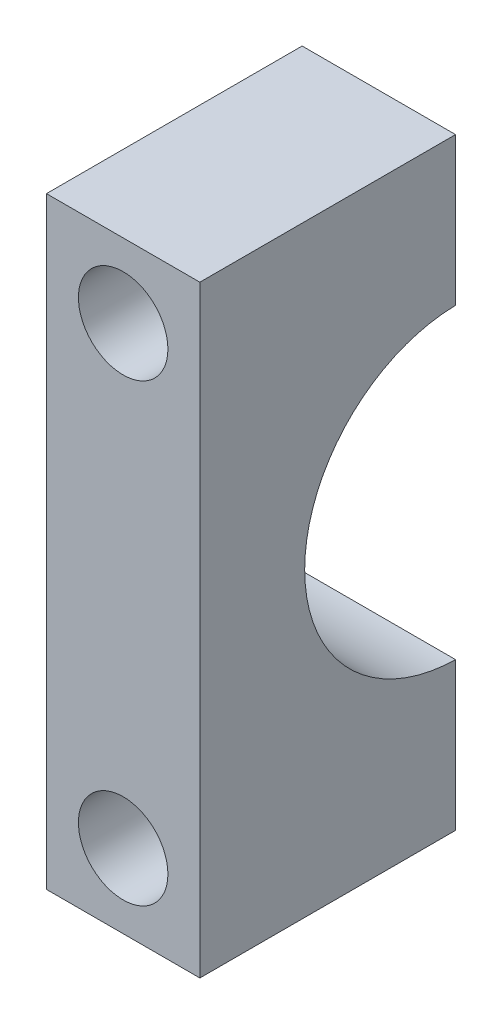
ISO-10303-21;
HEADER;
FILE_DESCRIPTION(('STEP AP214'),'2;1');
FILE_NAME('part.step','',(''),(''),'','','');
FILE_SCHEMA(('AUTOMOTIVE_DESIGN { 1 0 10303 214 1 1 1 1 }'));
ENDSEC;
DATA;
#1=APPLICATION_CONTEXT('core data for automotive mechanical design processes');
#2=APPLICATION_PROTOCOL_DEFINITION('international standard','automotive_design',2000,#1);
#3=PRODUCT_CONTEXT('',#1,'mechanical');
#4=PRODUCT('Part','Part','',(#3));
#5=PRODUCT_RELATED_PRODUCT_CATEGORY('part','',(#4));
#6=PRODUCT_DEFINITION_FORMATION('','',#4);
#7=PRODUCT_DEFINITION_CONTEXT('part definition',#1,'design');
#8=PRODUCT_DEFINITION('design','',#6,#7);
#9=PRODUCT_DEFINITION_SHAPE('','',#8);
#10=(LENGTH_UNIT() NAMED_UNIT(*) SI_UNIT(.MILLI.,.METRE.));
#11=(NAMED_UNIT(*) PLANE_ANGLE_UNIT() SI_UNIT($,.RADIAN.));
#12=(NAMED_UNIT(*) SI_UNIT($,.STERADIAN.) SOLID_ANGLE_UNIT());
#13=UNCERTAINTY_MEASURE_WITH_UNIT(LENGTH_MEASURE(1.E-05),#10,'distance_accuracy_value','');
#14=(GEOMETRIC_REPRESENTATION_CONTEXT(3) GLOBAL_UNCERTAINTY_ASSIGNED_CONTEXT((#13)) GLOBAL_UNIT_ASSIGNED_CONTEXT((#10,
#11,#12)) REPRESENTATION_CONTEXT('',''));
#15=CARTESIAN_POINT('',(0.,0.,0.));
#16=DIRECTION('',(0.,0.,1.));
#17=DIRECTION('',(1.,0.,0.));
#18=AXIS2_PLACEMENT_3D('',#15,#16,#17);
#19=CARTESIAN_POINT('',(0.,0.,0.));
#20=DIRECTION('',(0.,0.,1.));
#21=DIRECTION('',(1.,0.,0.));
#22=AXIS2_PLACEMENT_3D('',#19,#20,#21);
#23=PLANE('',#22);
#24=CARTESIAN_POINT('',(22.8159945528906,5.38459103668775,0.));
#25=DIRECTION('',(0.,0.,1.));
#26=DIRECTION('',(1.,0.,0.));
#27=AXIS2_PLACEMENT_3D('',#24,#25,#26);
#28=CIRCLE('',#27,1.75);
#29=CARTESIAN_POINT('',(24.5659945528906,5.38459103668775,0.));
#30=VERTEX_POINT('',#29);
#31=EDGE_CURVE('E112',#30,#30,#28,.T.);
#32=ORIENTED_EDGE('',*,*,#31,.T.);
#33=EDGE_LOOP('',(#32));
#34=FACE_BOUND('',#33,.T.);
#35=DIRECTION('',(0.,1.,0.));
#36=VECTOR('',#35,1.);
#37=CARTESIAN_POINT('',(25.8159945528906,2.49212340256032,0.));
#38=LINE('',#37,#36);
#39=CARTESIAN_POINT('',(25.8159945528906,2.49212340256033,0.));
#40=VERTEX_POINT('',#39);
#41=CARTESIAN_POINT('',(25.8159945528906,8.27705867081517,0.));
#42=VERTEX_POINT('',#41);
#43=EDGE_CURVE('E118',#40,#42,#38,.T.);
#44=ORIENTED_EDGE('',*,*,#43,.F.);
#45=DIRECTION('',(-1.,0.,0.));
#46=VECTOR('',#45,1.);
#47=CARTESIAN_POINT('',(25.8159945528906,2.49212340256033,0.));
#48=LINE('',#47,#46);
#49=CARTESIAN_POINT('',(19.8159945528906,2.49212340256033,0.));
#50=VERTEX_POINT('',#49);
#51=EDGE_CURVE('E104',#40,#50,#48,.T.);
#52=ORIENTED_EDGE('',*,*,#51,.T.);
#53=DIRECTION('',(0.,-1.,0.));
#54=VECTOR('',#53,1.);
#55=CARTESIAN_POINT('',(19.8159945528906,8.27705867081517,0.));
#56=LINE('',#55,#54);
#57=CARTESIAN_POINT('',(19.8159945528906,8.27705867081517,0.));
#58=VERTEX_POINT('',#57);
#59=EDGE_CURVE('E131',#58,#50,#56,.T.);
#60=ORIENTED_EDGE('',*,*,#59,.F.);
#61=DIRECTION('',(-1.,0.,0.));
#62=VECTOR('',#61,1.);
#63=CARTESIAN_POINT('',(25.8159945528906,8.27705867081517,0.));
#64=LINE('',#63,#62);
#65=EDGE_CURVE('E93',#42,#58,#64,.T.);
#66=ORIENTED_EDGE('',*,*,#65,.F.);
#67=EDGE_LOOP('',(#44,#52,#60,#66));
#68=FACE_BOUND('',#67,.T.);
#69=ADVANCED_FACE('F47',(#34,#68),#23,.F.);
#70=CARTESIAN_POINT('',(0.,0.,10.));
#71=DIRECTION('',(0.,0.,1.));
#72=DIRECTION('',(1.,0.,0.));
#73=AXIS2_PLACEMENT_3D('',#70,#71,#72);
#74=PLANE('',#73);
#75=CARTESIAN_POINT('',(22.8159945528906,-12.3986870424483,10.));
#76=DIRECTION('',(0.,0.,1.));
#77=DIRECTION('',(1.,0.,0.));
#78=AXIS2_PLACEMENT_3D('',#75,#76,#77);
#79=CIRCLE('',#78,1.75);
#80=CARTESIAN_POINT('',(24.5659945528906,-12.3986870424483,10.));
#81=VERTEX_POINT('',#80);
#82=EDGE_CURVE('E125',#81,#81,#79,.T.);
#83=ORIENTED_EDGE('',*,*,#82,.F.);
#84=EDGE_LOOP('',(#83));
#85=FACE_BOUND('',#84,.T.);
#86=DIRECTION('',(0.,-1.,0.));
#87=VECTOR('',#86,1.);
#88=CARTESIAN_POINT('',(19.8159945528906,-9.5062194083209,10.));
#89=LINE('',#88,#87);
#90=CARTESIAN_POINT('',(19.8159945528906,8.27705867081517,10.));
#91=VERTEX_POINT('',#90);
#92=CARTESIAN_POINT('',(19.8159945528906,-15.2911546765757,10.));
#93=VERTEX_POINT('',#92);
#94=EDGE_CURVE('E70',#91,#93,#89,.T.);
#95=ORIENTED_EDGE('',*,*,#94,.T.);
#96=DIRECTION('',(1.,0.,0.));
#97=VECTOR('',#96,1.);
#98=CARTESIAN_POINT('',(19.8159945528906,-15.2911546765757,10.));
#99=LINE('',#98,#97);
#100=CARTESIAN_POINT('',(25.8159945528906,-15.2911546765757,10.));
#101=VERTEX_POINT('',#100);
#102=EDGE_CURVE('E144',#93,#101,#99,.T.);
#103=ORIENTED_EDGE('',*,*,#102,.T.);
#104=DIRECTION('',(0.,1.,0.));
#105=VECTOR('',#104,1.);
#106=CARTESIAN_POINT('',(25.8159945528906,-15.2911546765757,10.));
#107=LINE('',#106,#105);
#108=CARTESIAN_POINT('',(25.8159945528906,8.27705867081517,10.));
#109=VERTEX_POINT('',#108);
#110=EDGE_CURVE('E163',#101,#109,#107,.T.);
#111=ORIENTED_EDGE('',*,*,#110,.T.);
#112=DIRECTION('',(-1.,0.,0.));
#113=VECTOR('',#112,1.);
#114=CARTESIAN_POINT('',(25.8159945528906,8.27705867081517,10.));
#115=LINE('',#114,#113);
#116=EDGE_CURVE('E136',#109,#91,#115,.T.);
#117=ORIENTED_EDGE('',*,*,#116,.T.);
#118=EDGE_LOOP('',(#95,#103,#111,#117));
#119=FACE_BOUND('',#118,.T.);
#120=CARTESIAN_POINT('',(22.8159945528906,5.38459103668775,10.));
#121=DIRECTION('',(0.,0.,1.));
#122=DIRECTION('',(1.,0.,0.));
#123=AXIS2_PLACEMENT_3D('',#120,#121,#122);
#124=CIRCLE('',#123,1.75);
#125=CARTESIAN_POINT('',(24.5659945528906,5.38459103668775,10.));
#126=VERTEX_POINT('',#125);
#127=EDGE_CURVE('E151',#126,#126,#124,.T.);
#128=ORIENTED_EDGE('',*,*,#127,.F.);
#129=EDGE_LOOP('',(#128));
#130=FACE_BOUND('',#129,.T.);
#131=ADVANCED_FACE('F165',(#85,#119,#130),#74,.T.);
#132=CARTESIAN_POINT('',(19.8159945528906,-9.5062194083209,0.));
#133=VERTEX_POINT('',#132);
#134=CARTESIAN_POINT('',(19.8159945528906,-15.2911546765757,0.));
#135=VERTEX_POINT('',#134);
#136=EDGE_CURVE('E130',#133,#135,#56,.T.);
#137=ORIENTED_EDGE('',*,*,#136,.F.);
#138=DIRECTION('',(-1.,0.,0.));
#139=VECTOR('',#138,1.);
#140=CARTESIAN_POINT('',(25.8159945528906,-9.5062194083209,0.));
#141=LINE('',#140,#139);
#142=CARTESIAN_POINT('',(25.8159945528906,-9.5062194083209,0.));
#143=VERTEX_POINT('',#142);
#144=EDGE_CURVE('E62',#133,#143,#141,.F.);
#145=ORIENTED_EDGE('',*,*,#144,.T.);
#146=CARTESIAN_POINT('',(25.8159945528906,-15.2911546765757,0.));
#147=VERTEX_POINT('',#146);
#148=EDGE_CURVE('E120',#147,#143,#38,.T.);
#149=ORIENTED_EDGE('',*,*,#148,.F.);
#150=DIRECTION('',(1.,0.,0.));
#151=VECTOR('',#150,1.);
#152=CARTESIAN_POINT('',(19.8159945528906,-15.2911546765757,0.));
#153=LINE('',#152,#151);
#154=EDGE_CURVE('E122',#135,#147,#153,.T.);
#155=ORIENTED_EDGE('',*,*,#154,.F.);
#156=EDGE_LOOP('',(#137,#145,#149,#155));
#157=FACE_BOUND('',#156,.T.);
#158=CARTESIAN_POINT('',(22.8159945528906,-12.3986870424483,0.));
#159=DIRECTION('',(0.,0.,1.));
#160=DIRECTION('',(1.,0.,0.));
#161=AXIS2_PLACEMENT_3D('',#158,#159,#160);
#162=CIRCLE('',#161,1.75);
#163=CARTESIAN_POINT('',(24.5659945528906,-12.3986870424483,0.));
#164=VERTEX_POINT('',#163);
#165=EDGE_CURVE('E154',#164,#164,#162,.T.);
#166=ORIENTED_EDGE('',*,*,#165,.T.);
#167=EDGE_LOOP('',(#166));
#168=FACE_BOUND('',#167,.T.);
#169=ADVANCED_FACE('F147',(#157,#168),#23,.F.);
#170=CARTESIAN_POINT('',(19.8159945528906,-15.2911546765757,10.));
#171=DIRECTION('',(0.,1.,0.));
#172=DIRECTION('',(0.,0.,1.));
#173=AXIS2_PLACEMENT_3D('',#170,#171,#172);
#174=PLANE('',#173);
#175=ORIENTED_EDGE('',*,*,#154,.T.);
#176=DIRECTION('',(0.,0.,-1.));
#177=VECTOR('',#176,1.);
#178=CARTESIAN_POINT('',(25.8159945528906,-15.2911546765757,10.));
#179=LINE('',#178,#177);
#180=EDGE_CURVE('E138',#101,#147,#179,.T.);
#181=ORIENTED_EDGE('',*,*,#180,.F.);
#182=ORIENTED_EDGE('',*,*,#102,.F.);
#183=DIRECTION('',(0.,0.,-1.));
#184=VECTOR('',#183,1.);
#185=CARTESIAN_POINT('',(19.8159945528906,-15.2911546765757,10.));
#186=LINE('',#185,#184);
#187=EDGE_CURVE('E55',#93,#135,#186,.T.);
#188=ORIENTED_EDGE('',*,*,#187,.T.);
#189=EDGE_LOOP('',(#175,#181,#182,#188));
#190=FACE_BOUND('',#189,.T.);
#191=ADVANCED_FACE('F49',(#190),#174,.F.);
#192=CARTESIAN_POINT('',(25.8159945528906,2.49212340256032,10.));
#193=DIRECTION('',(-1.,0.,0.));
#194=DIRECTION('',(0.,0.,1.));
#195=AXIS2_PLACEMENT_3D('',#192,#193,#194);
#196=PLANE('',#195);
#197=ORIENTED_EDGE('',*,*,#148,.T.);
#198=CARTESIAN_POINT('',(25.8159945528906,-3.50704800288029,-0.0997118254956221));
#199=DIRECTION('',(-1.,0.,0.));
#200=DIRECTION('',(0.,0.,1.));
#201=AXIS2_PLACEMENT_3D('',#198,#199,#200);
#202=CIRCLE('',#201,6.);
#203=EDGE_CURVE('E107',#143,#40,#202,.T.);
#204=ORIENTED_EDGE('',*,*,#203,.T.);
#205=ORIENTED_EDGE('',*,*,#43,.T.);
#206=DIRECTION('',(0.,0.,-1.));
#207=VECTOR('',#206,1.);
#208=CARTESIAN_POINT('',(25.8159945528906,8.27705867081517,10.));
#209=LINE('',#208,#207);
#210=EDGE_CURVE('E135',#109,#42,#209,.T.);
#211=ORIENTED_EDGE('',*,*,#210,.F.);
#212=ORIENTED_EDGE('',*,*,#110,.F.);
#213=ORIENTED_EDGE('',*,*,#180,.T.);
#214=EDGE_LOOP('',(#197,#204,#205,#211,#212,#213));
#215=FACE_BOUND('',#214,.T.);
#216=ADVANCED_FACE('F116',(#215),#196,.F.);
#217=CARTESIAN_POINT('',(25.8159945528906,8.27705867081517,10.));
#218=DIRECTION('',(0.,-1.,0.));
#219=DIRECTION('',(0.,0.,-1.));
#220=AXIS2_PLACEMENT_3D('',#217,#218,#219);
#221=PLANE('',#220);
#222=ORIENTED_EDGE('',*,*,#65,.T.);
#223=DIRECTION('',(0.,0.,-1.));
#224=VECTOR('',#223,1.);
#225=CARTESIAN_POINT('',(19.8159945528906,8.27705867081517,10.));
#226=LINE('',#225,#224);
#227=EDGE_CURVE('E133',#91,#58,#226,.T.);
#228=ORIENTED_EDGE('',*,*,#227,.F.);
#229=ORIENTED_EDGE('',*,*,#116,.F.);
#230=ORIENTED_EDGE('',*,*,#210,.T.);
#231=EDGE_LOOP('',(#222,#228,#229,#230));
#232=FACE_BOUND('',#231,.T.);
#233=ADVANCED_FACE('F168',(#232),#221,.F.);
#234=CARTESIAN_POINT('',(19.8159945528906,8.27705867081517,10.));
#235=DIRECTION('',(1.,0.,0.));
#236=DIRECTION('',(0.,0.,-1.));
#237=AXIS2_PLACEMENT_3D('',#234,#235,#236);
#238=PLANE('',#237);
#239=ORIENTED_EDGE('',*,*,#59,.T.);
#240=CARTESIAN_POINT('',(19.8159945528906,-3.50704800288029,-0.0997118254956221));
#241=DIRECTION('',(1.,0.,0.));
#242=DIRECTION('',(0.,0.,-1.));
#243=AXIS2_PLACEMENT_3D('',#240,#241,#242);
#244=CIRCLE('',#243,6.);
#245=EDGE_CURVE('E13',#50,#133,#244,.T.);
#246=ORIENTED_EDGE('',*,*,#245,.T.);
#247=ORIENTED_EDGE('',*,*,#136,.T.);
#248=ORIENTED_EDGE('',*,*,#187,.F.);
#249=ORIENTED_EDGE('',*,*,#94,.F.);
#250=ORIENTED_EDGE('',*,*,#227,.T.);
#251=EDGE_LOOP('',(#239,#246,#247,#248,#249,#250));
#252=FACE_BOUND('',#251,.T.);
#253=ADVANCED_FACE('F169',(#252),#238,.F.);
#254=CARTESIAN_POINT('',(22.8159945528906,-12.3986870424483,10.));
#255=DIRECTION('',(0.,0.,-1.));
#256=DIRECTION('',(-1.,0.,0.));
#257=AXIS2_PLACEMENT_3D('',#254,#255,#256);
#258=CYLINDRICAL_SURFACE('',#257,1.75);
#259=ORIENTED_EDGE('',*,*,#82,.T.);
#260=EDGE_LOOP('',(#259));
#261=FACE_BOUND('',#260,.T.);
#262=ORIENTED_EDGE('',*,*,#165,.F.);
#263=EDGE_LOOP('',(#262));
#264=FACE_BOUND('',#263,.T.);
#265=ADVANCED_FACE('F171',(#261,#264),#258,.F.);
#266=CARTESIAN_POINT('',(22.8159945528906,5.38459103668775,10.));
#267=DIRECTION('',(0.,0.,-1.));
#268=DIRECTION('',(-1.,0.,0.));
#269=AXIS2_PLACEMENT_3D('',#266,#267,#268);
#270=CYLINDRICAL_SURFACE('',#269,1.75);
#271=ORIENTED_EDGE('',*,*,#127,.T.);
#272=EDGE_LOOP('',(#271));
#273=FACE_BOUND('',#272,.T.);
#274=ORIENTED_EDGE('',*,*,#31,.F.);
#275=EDGE_LOOP('',(#274));
#276=FACE_BOUND('',#275,.T.);
#277=ADVANCED_FACE('F177',(#273,#276),#270,.F.);
#278=CARTESIAN_POINT('',(25.8159945528906,-3.50704800288029,-0.0997118254956221));
#279=DIRECTION('',(-1.,0.,0.));
#280=DIRECTION('',(0.,0.,1.));
#281=AXIS2_PLACEMENT_3D('',#278,#279,#280);
#282=CYLINDRICAL_SURFACE('',#281,6.);
#283=ORIENTED_EDGE('',*,*,#203,.F.);
#284=ORIENTED_EDGE('',*,*,#144,.F.);
#285=ORIENTED_EDGE('',*,*,#245,.F.);
#286=ORIENTED_EDGE('',*,*,#51,.F.);
#287=EDGE_LOOP('',(#283,#284,#285,#286));
#288=FACE_BOUND('',#287,.T.);
#289=ADVANCED_FACE('F106',(#288),#282,.F.);
#290=CLOSED_SHELL('',(#69,#131,#169,#191,#216,#233,#253,#265,#277,#289));
#291=MANIFOLD_SOLID_BREP('B2',#290);
#292=ADVANCED_BREP_SHAPE_REPRESENTATION('',(#18,#291),#14);
#293=SHAPE_DEFINITION_REPRESENTATION(#9,#292);
ENDSEC;
END-ISO-10303-21;
